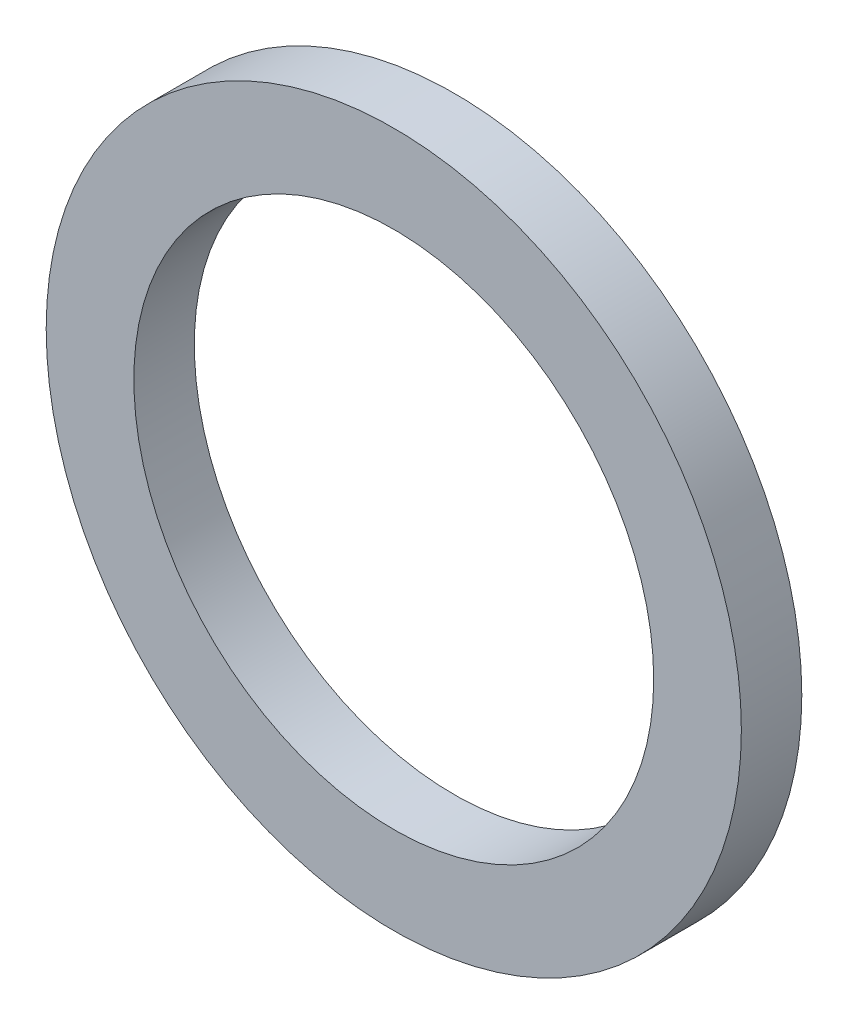
ISO-10303-21;
HEADER;
FILE_DESCRIPTION(('STEP AP214'),'2;1');
FILE_NAME('part.step','',(''),(''),'','','');
FILE_SCHEMA(('AUTOMOTIVE_DESIGN { 1 0 10303 214 1 1 1 1 }'));
ENDSEC;
DATA;
#1=APPLICATION_CONTEXT('core data for automotive mechanical design processes');
#2=APPLICATION_PROTOCOL_DEFINITION('international standard','automotive_design',2000,#1);
#3=PRODUCT_CONTEXT('',#1,'mechanical');
#4=PRODUCT('Part','Part','',(#3));
#5=PRODUCT_RELATED_PRODUCT_CATEGORY('part','',(#4));
#6=PRODUCT_DEFINITION_FORMATION('','',#4);
#7=PRODUCT_DEFINITION_CONTEXT('part definition',#1,'design');
#8=PRODUCT_DEFINITION('design','',#6,#7);
#9=PRODUCT_DEFINITION_SHAPE('','',#8);
#10=(LENGTH_UNIT() NAMED_UNIT(*) SI_UNIT(.MILLI.,.METRE.));
#11=(NAMED_UNIT(*) PLANE_ANGLE_UNIT() SI_UNIT($,.RADIAN.));
#12=(NAMED_UNIT(*) SI_UNIT($,.STERADIAN.) SOLID_ANGLE_UNIT());
#13=UNCERTAINTY_MEASURE_WITH_UNIT(LENGTH_MEASURE(1.E-05),#10,'distance_accuracy_value','');
#14=(GEOMETRIC_REPRESENTATION_CONTEXT(3) GLOBAL_UNCERTAINTY_ASSIGNED_CONTEXT((#13)) GLOBAL_UNIT_ASSIGNED_CONTEXT((#10,
#11,#12)) REPRESENTATION_CONTEXT('',''));
#15=CARTESIAN_POINT('',(0.,0.,0.));
#16=DIRECTION('',(0.,0.,1.));
#17=DIRECTION('',(1.,0.,0.));
#18=AXIS2_PLACEMENT_3D('',#15,#16,#17);
#19=CARTESIAN_POINT('',(0.,0.,2.));
#20=DIRECTION('',(0.,0.,1.));
#21=DIRECTION('',(1.,0.,0.));
#22=AXIS2_PLACEMENT_3D('',#19,#20,#21);
#23=PLANE('',#22);
#24=CARTESIAN_POINT('',(0.,0.,2.));
#25=DIRECTION('',(0.,0.,1.));
#26=DIRECTION('',(1.,0.,0.));
#27=AXIS2_PLACEMENT_3D('',#24,#25,#26);
#28=CIRCLE('',#27,11.5);
#29=CARTESIAN_POINT('',(11.5,0.,2.));
#30=VERTEX_POINT('',#29);
#31=EDGE_CURVE('E10',#30,#30,#28,.T.);
#32=ORIENTED_EDGE('',*,*,#31,.T.);
#33=EDGE_LOOP('',(#32));
#34=FACE_BOUND('',#33,.T.);
#35=CARTESIAN_POINT('',(0.,0.,2.));
#36=DIRECTION('',(0.,0.,1.));
#37=DIRECTION('',(1.,0.,0.));
#38=AXIS2_PLACEMENT_3D('',#35,#36,#37);
#39=CIRCLE('',#38,8.6);
#40=CARTESIAN_POINT('',(8.6,0.,2.));
#41=VERTEX_POINT('',#40);
#42=EDGE_CURVE('E46',#41,#41,#39,.T.);
#43=ORIENTED_EDGE('',*,*,#42,.F.);
#44=EDGE_LOOP('',(#43));
#45=FACE_BOUND('',#44,.T.);
#46=ADVANCED_FACE('F35',(#34,#45),#23,.T.);
#47=CARTESIAN_POINT('',(0.,0.,0.));
#48=DIRECTION('',(0.,0.,1.));
#49=DIRECTION('',(1.,0.,0.));
#50=AXIS2_PLACEMENT_3D('',#47,#48,#49);
#51=PLANE('',#50);
#52=CARTESIAN_POINT('',(0.,0.,0.));
#53=DIRECTION('',(0.,0.,1.));
#54=DIRECTION('',(1.,0.,0.));
#55=AXIS2_PLACEMENT_3D('',#52,#53,#54);
#56=CIRCLE('',#55,11.5);
#57=CARTESIAN_POINT('',(11.5,0.,0.));
#58=VERTEX_POINT('',#57);
#59=EDGE_CURVE('E39',#58,#58,#56,.T.);
#60=ORIENTED_EDGE('',*,*,#59,.F.);
#61=EDGE_LOOP('',(#60));
#62=FACE_BOUND('',#61,.T.);
#63=CARTESIAN_POINT('',(0.,0.,0.));
#64=DIRECTION('',(0.,0.,1.));
#65=DIRECTION('',(1.,0.,0.));
#66=AXIS2_PLACEMENT_3D('',#63,#64,#65);
#67=CIRCLE('',#66,8.6);
#68=CARTESIAN_POINT('',(8.6,0.,0.));
#69=VERTEX_POINT('',#68);
#70=EDGE_CURVE('E48',#69,#69,#67,.T.);
#71=ORIENTED_EDGE('',*,*,#70,.T.);
#72=EDGE_LOOP('',(#71));
#73=FACE_BOUND('',#72,.T.);
#74=ADVANCED_FACE('F58',(#62,#73),#51,.F.);
#75=CARTESIAN_POINT('',(0.,0.,2.));
#76=DIRECTION('',(0.,0.,-1.));
#77=DIRECTION('',(-1.,0.,0.));
#78=AXIS2_PLACEMENT_3D('',#75,#76,#77);
#79=CYLINDRICAL_SURFACE('',#78,11.5);
#80=ORIENTED_EDGE('',*,*,#31,.F.);
#81=EDGE_LOOP('',(#80));
#82=FACE_BOUND('',#81,.T.);
#83=ORIENTED_EDGE('',*,*,#59,.T.);
#84=EDGE_LOOP('',(#83));
#85=FACE_BOUND('',#84,.T.);
#86=ADVANCED_FACE('F37',(#82,#85),#79,.T.);
#87=CARTESIAN_POINT('',(0.,0.,2.));
#88=DIRECTION('',(0.,0.,-1.));
#89=DIRECTION('',(-1.,0.,0.));
#90=AXIS2_PLACEMENT_3D('',#87,#88,#89);
#91=CYLINDRICAL_SURFACE('',#90,8.6);
#92=ORIENTED_EDGE('',*,*,#42,.T.);
#93=EDGE_LOOP('',(#92));
#94=FACE_BOUND('',#93,.T.);
#95=ORIENTED_EDGE('',*,*,#70,.F.);
#96=EDGE_LOOP('',(#95));
#97=FACE_BOUND('',#96,.T.);
#98=ADVANCED_FACE('F54',(#94,#97),#91,.F.);
#99=CLOSED_SHELL('',(#46,#74,#86,#98));
#100=MANIFOLD_SOLID_BREP('B2',#99);
#101=ADVANCED_BREP_SHAPE_REPRESENTATION('',(#18,#100),#14);
#102=SHAPE_DEFINITION_REPRESENTATION(#9,#101);
ENDSEC;
END-ISO-10303-21;
